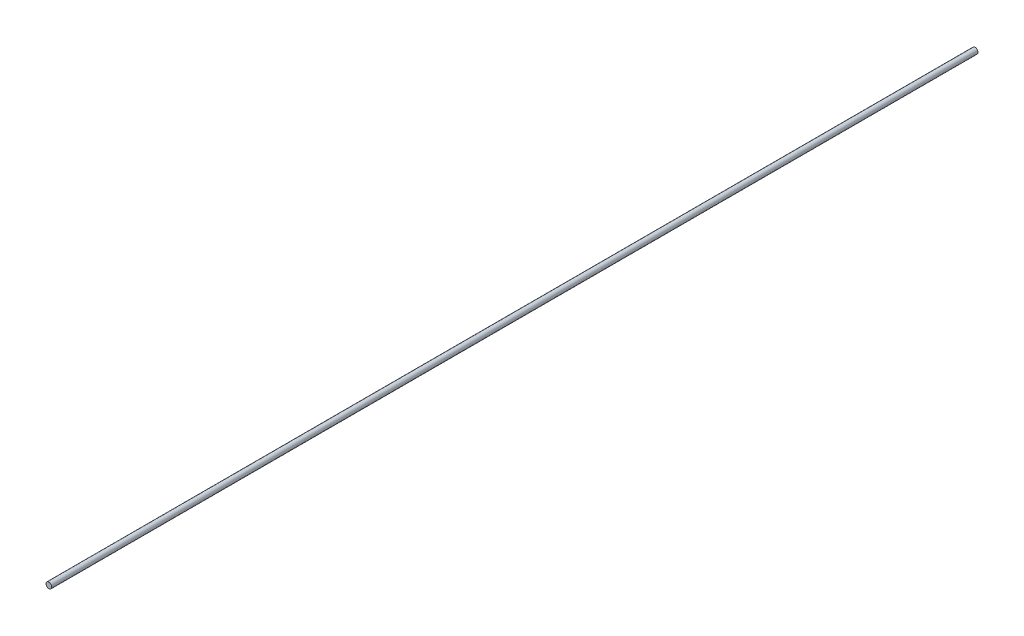
ISO-10303-21;
HEADER;
FILE_DESCRIPTION(('STEP AP214'),'2;1');
FILE_NAME('part.step','',(''),(''),'','','');
FILE_SCHEMA(('AUTOMOTIVE_DESIGN { 1 0 10303 214 1 1 1 1 }'));
ENDSEC;
DATA;
#1=APPLICATION_CONTEXT('core data for automotive mechanical design processes');
#2=APPLICATION_PROTOCOL_DEFINITION('international standard','automotive_design',2000,#1);
#3=PRODUCT_CONTEXT('',#1,'mechanical');
#4=PRODUCT('Part','Part','',(#3));
#5=PRODUCT_RELATED_PRODUCT_CATEGORY('part','',(#4));
#6=PRODUCT_DEFINITION_FORMATION('','',#4);
#7=PRODUCT_DEFINITION_CONTEXT('part definition',#1,'design');
#8=PRODUCT_DEFINITION('design','',#6,#7);
#9=PRODUCT_DEFINITION_SHAPE('','',#8);
#10=(LENGTH_UNIT() NAMED_UNIT(*) SI_UNIT(.MILLI.,.METRE.));
#11=(NAMED_UNIT(*) PLANE_ANGLE_UNIT() SI_UNIT($,.RADIAN.));
#12=(NAMED_UNIT(*) SI_UNIT($,.STERADIAN.) SOLID_ANGLE_UNIT());
#13=UNCERTAINTY_MEASURE_WITH_UNIT(LENGTH_MEASURE(1.E-05),#10,'distance_accuracy_value','');
#14=(GEOMETRIC_REPRESENTATION_CONTEXT(3) GLOBAL_UNCERTAINTY_ASSIGNED_CONTEXT((#13)) GLOBAL_UNIT_ASSIGNED_CONTEXT((#10,
#11,#12)) REPRESENTATION_CONTEXT('',''));
#15=CARTESIAN_POINT('',(0.,0.,0.));
#16=DIRECTION('',(0.,0.,1.));
#17=DIRECTION('',(1.,0.,0.));
#18=AXIS2_PLACEMENT_3D('',#15,#16,#17);
#19=CARTESIAN_POINT('',(0.,0.,128.697582912017));
#20=DIRECTION('',(0.,0.,-1.));
#21=DIRECTION('',(-1.,0.,0.));
#22=AXIS2_PLACEMENT_3D('',#19,#20,#21);
#23=CYLINDRICAL_SURFACE('',#22,0.4);
#24=CARTESIAN_POINT('',(0.,0.,128.697582912017));
#25=DIRECTION('',(0.,0.,1.));
#26=DIRECTION('',(1.,0.,0.));
#27=AXIS2_PLACEMENT_3D('',#24,#25,#26);
#28=CIRCLE('',#27,0.4);
#29=CARTESIAN_POINT('',(0.4,0.,128.697582912017));
#30=VERTEX_POINT('',#29);
#31=EDGE_CURVE('E10',#30,#30,#28,.T.);
#32=ORIENTED_EDGE('',*,*,#31,.F.);
#33=EDGE_LOOP('',(#32));
#34=FACE_BOUND('',#33,.T.);
#35=CARTESIAN_POINT('',(0.,0.,0.));
#36=DIRECTION('',(0.,0.,1.));
#37=DIRECTION('',(1.,0.,0.));
#38=AXIS2_PLACEMENT_3D('',#35,#36,#37);
#39=CIRCLE('',#38,0.4);
#40=CARTESIAN_POINT('',(0.4,0.,0.));
#41=VERTEX_POINT('',#40);
#42=EDGE_CURVE('E40',#41,#41,#39,.T.);
#43=ORIENTED_EDGE('',*,*,#42,.T.);
#44=EDGE_LOOP('',(#43));
#45=FACE_BOUND('',#44,.T.);
#46=ADVANCED_FACE('F37',(#34,#45),#23,.T.);
#47=CARTESIAN_POINT('',(0.,0.,128.697582912017));
#48=DIRECTION('',(0.,0.,1.));
#49=DIRECTION('',(1.,0.,0.));
#50=AXIS2_PLACEMENT_3D('',#47,#48,#49);
#51=PLANE('',#50);
#52=ORIENTED_EDGE('',*,*,#31,.T.);
#53=EDGE_LOOP('',(#52));
#54=FACE_BOUND('',#53,.T.);
#55=ADVANCED_FACE('F52',(#54),#51,.T.);
#56=CARTESIAN_POINT('',(0.,0.,0.));
#57=DIRECTION('',(0.,0.,1.));
#58=DIRECTION('',(1.,0.,0.));
#59=AXIS2_PLACEMENT_3D('',#56,#57,#58);
#60=PLANE('',#59);
#61=ORIENTED_EDGE('',*,*,#42,.F.);
#62=EDGE_LOOP('',(#61));
#63=FACE_BOUND('',#62,.T.);
#64=ADVANCED_FACE('F50',(#63),#60,.F.);
#65=CLOSED_SHELL('',(#46,#55,#64));
#66=MANIFOLD_SOLID_BREP('B2',#65);
#67=ADVANCED_BREP_SHAPE_REPRESENTATION('',(#18,#66),#14);
#68=SHAPE_DEFINITION_REPRESENTATION(#9,#67);
ENDSEC;
END-ISO-10303-21;
